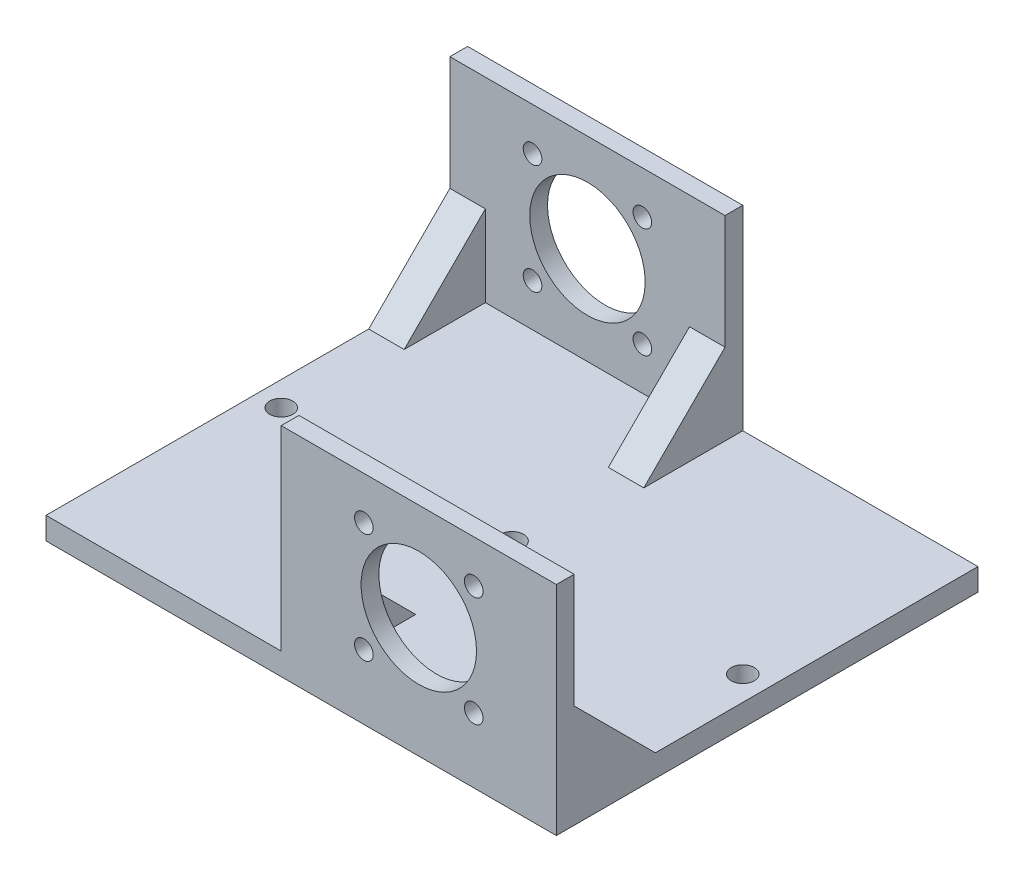
ISO-10303-21;
HEADER;
FILE_DESCRIPTION(('STEP AP214'),'2;1');
FILE_NAME('part.step','',(''),(''),'','','');
FILE_SCHEMA(('AUTOMOTIVE_DESIGN { 1 0 10303 214 1 1 1 1 }'));
ENDSEC;
DATA;
#1=APPLICATION_CONTEXT('core data for automotive mechanical design processes');
#2=APPLICATION_PROTOCOL_DEFINITION('international standard','automotive_design',2000,#1);
#3=PRODUCT_CONTEXT('',#1,'mechanical');
#4=PRODUCT('Part','Part','',(#3));
#5=PRODUCT_RELATED_PRODUCT_CATEGORY('part','',(#4));
#6=PRODUCT_DEFINITION_FORMATION('','',#4);
#7=PRODUCT_DEFINITION_CONTEXT('part definition',#1,'design');
#8=PRODUCT_DEFINITION('design','',#6,#7);
#9=PRODUCT_DEFINITION_SHAPE('','',#8);
#10=(LENGTH_UNIT() NAMED_UNIT(*) SI_UNIT(.MILLI.,.METRE.));
#11=(NAMED_UNIT(*) PLANE_ANGLE_UNIT() SI_UNIT($,.RADIAN.));
#12=(NAMED_UNIT(*) SI_UNIT($,.STERADIAN.) SOLID_ANGLE_UNIT());
#13=UNCERTAINTY_MEASURE_WITH_UNIT(LENGTH_MEASURE(1.E-05),#10,'distance_accuracy_value','');
#14=(GEOMETRIC_REPRESENTATION_CONTEXT(3) GLOBAL_UNCERTAINTY_ASSIGNED_CONTEXT((#13)) GLOBAL_UNIT_ASSIGNED_CONTEXT((#10,
#11,#12)) REPRESENTATION_CONTEXT('',''));
#15=CARTESIAN_POINT('',(0.,0.,0.));
#16=DIRECTION('',(0.,0.,1.));
#17=DIRECTION('',(1.,0.,0.));
#18=AXIS2_PLACEMENT_3D('',#15,#16,#17);
#19=CARTESIAN_POINT('',(0.,5.,0.));
#20=DIRECTION('',(0.,1.,0.));
#21=DIRECTION('',(0.,0.,1.));
#22=AXIS2_PLACEMENT_3D('',#19,#20,#21);
#23=PLANE('',#22);
#24=CARTESIAN_POINT('',(-52.,5.,0.));
#25=DIRECTION('',(0.,1.,0.));
#26=DIRECTION('',(0.,0.,-1.));
#27=AXIS2_PLACEMENT_3D('',#24,#25,#26);
#28=CIRCLE('',#27,2.6);
#29=CARTESIAN_POINT('',(-52.,5.,-2.6));
#30=VERTEX_POINT('',#29);
#31=EDGE_CURVE('E478',#30,#30,#28,.T.);
#32=ORIENTED_EDGE('',*,*,#31,.F.);
#33=EDGE_LOOP('',(#32));
#34=FACE_BOUND('',#33,.T.);
#35=CARTESIAN_POINT('',(52.,5.,0.));
#36=DIRECTION('',(0.,1.,0.));
#37=DIRECTION('',(0.,0.,1.));
#38=AXIS2_PLACEMENT_3D('',#35,#36,#37);
#39=CIRCLE('',#38,2.6);
#40=CARTESIAN_POINT('',(52.,5.,2.6));
#41=VERTEX_POINT('',#40);
#42=EDGE_CURVE('E473',#41,#41,#39,.T.);
#43=ORIENTED_EDGE('',*,*,#42,.F.);
#44=EDGE_LOOP('',(#43));
#45=FACE_BOUND('',#44,.T.);
#46=CARTESIAN_POINT('',(0.,5.,0.));
#47=DIRECTION('',(0.,1.,0.));
#48=DIRECTION('',(0.,0.,1.));
#49=AXIS2_PLACEMENT_3D('',#46,#47,#48);
#50=CIRCLE('',#49,2.6);
#51=CARTESIAN_POINT('',(0.,5.,2.6));
#52=VERTEX_POINT('',#51);
#53=EDGE_CURVE('E476',#52,#52,#50,.T.);
#54=ORIENTED_EDGE('',*,*,#53,.F.);
#55=EDGE_LOOP('',(#54));
#56=FACE_BOUND('',#55,.T.);
#57=DIRECTION('',(0.,0.,-1.));
#58=VECTOR('',#57,1.);
#59=CARTESIAN_POINT('',(-3.50000000000002,5.,-25.2000765028922));
#60=LINE('',#59,#58);
#61=CARTESIAN_POINT('',(-3.50000000000002,5.,-25.2000765028922));
#62=VERTEX_POINT('',#61);
#63=CARTESIAN_POINT('',(-3.50000000000003,5.,-43.5));
#64=VERTEX_POINT('',#63);
#65=EDGE_CURVE('E170',#62,#64,#60,.T.);
#66=ORIENTED_EDGE('',*,*,#65,.T.);
#67=DIRECTION('',(1.,0.,0.));
#68=VECTOR('',#67,1.);
#69=CARTESIAN_POINT('',(-57.5,5.,-43.5));
#70=LINE('',#69,#68);
#71=CARTESIAN_POINT('',(-49.5,5.,-43.5));
#72=VERTEX_POINT('',#71);
#73=EDGE_CURVE('E180',#72,#64,#70,.T.);
#74=ORIENTED_EDGE('',*,*,#73,.F.);
#75=DIRECTION('',(0.,0.,1.));
#76=VECTOR('',#75,1.);
#77=CARTESIAN_POINT('',(-49.5,5.,0.));
#78=LINE('',#77,#76);
#79=CARTESIAN_POINT('',(-49.5,5.,-25.2000765028922));
#80=VERTEX_POINT('',#79);
#81=EDGE_CURVE('E50',#72,#80,#78,.T.);
#82=ORIENTED_EDGE('',*,*,#81,.T.);
#83=DIRECTION('',(-1.,0.,0.));
#84=VECTOR('',#83,1.);
#85=CARTESIAN_POINT('',(0.,5.,-25.2000765028922));
#86=LINE('',#85,#84);
#87=CARTESIAN_POINT('',(-57.5,5.,-25.2000765028922));
#88=VERTEX_POINT('',#87);
#89=EDGE_CURVE('E54',#88,#80,#86,.F.);
#90=ORIENTED_EDGE('',*,*,#89,.F.);
#91=DIRECTION('',(0.,0.,1.));
#92=VECTOR('',#91,1.);
#93=CARTESIAN_POINT('',(-57.5,5.,-47.5));
#94=LINE('',#93,#92);
#95=CARTESIAN_POINT('',(-57.5,5.,47.5));
#96=VERTEX_POINT('',#95);
#97=EDGE_CURVE('E273',#88,#96,#94,.T.);
#98=ORIENTED_EDGE('',*,*,#97,.T.);
#99=DIRECTION('',(1.,0.,0.));
#100=VECTOR('',#99,1.);
#101=CARTESIAN_POINT('',(-57.5,5.,47.5));
#102=LINE('',#101,#100);
#103=CARTESIAN_POINT('',(-4.50000000000001,5.,47.5));
#104=VERTEX_POINT('',#103);
#105=EDGE_CURVE('E275',#96,#104,#102,.T.);
#106=ORIENTED_EDGE('',*,*,#105,.T.);
#107=DIRECTION('',(0.,0.,1.));
#108=VECTOR('',#107,1.);
#109=CARTESIAN_POINT('',(-4.50000000000001,5.,47.5));
#110=LINE('',#109,#108);
#111=CARTESIAN_POINT('',(-4.50000000000001,5.,25.1931640512547));
#112=VERTEX_POINT('',#111);
#113=EDGE_CURVE('E228',#112,#104,#110,.T.);
#114=ORIENTED_EDGE('',*,*,#113,.F.);
#115=DIRECTION('',(1.,0.,0.));
#116=VECTOR('',#115,1.);
#117=CARTESIAN_POINT('',(0.,5.,25.1931640512547));
#118=LINE('',#117,#116);
#119=CARTESIAN_POINT('',(3.49999999999999,5.,25.1931640512547));
#120=VERTEX_POINT('',#119);
#121=EDGE_CURVE('E206',#120,#112,#118,.F.);
#122=ORIENTED_EDGE('',*,*,#121,.F.);
#123=DIRECTION('',(0.,0.,1.));
#124=VECTOR('',#123,1.);
#125=CARTESIAN_POINT('',(3.5,5.,0.));
#126=LINE('',#125,#124);
#127=CARTESIAN_POINT('',(3.49999999999999,5.,43.5));
#128=VERTEX_POINT('',#127);
#129=EDGE_CURVE('E209',#120,#128,#126,.T.);
#130=ORIENTED_EDGE('',*,*,#129,.T.);
#131=DIRECTION('',(-1.,0.,0.));
#132=VECTOR('',#131,1.);
#133=CARTESIAN_POINT('',(57.5,5.,43.5));
#134=LINE('',#133,#132);
#135=CARTESIAN_POINT('',(49.5,5.,43.5));
#136=VERTEX_POINT('',#135);
#137=EDGE_CURVE('E223',#136,#128,#134,.T.);
#138=ORIENTED_EDGE('',*,*,#137,.F.);
#139=DIRECTION('',(0.,0.,-1.));
#140=VECTOR('',#139,1.);
#141=CARTESIAN_POINT('',(49.5,5.,0.));
#142=LINE('',#141,#140);
#143=CARTESIAN_POINT('',(49.5,5.,25.1931640512547));
#144=VERTEX_POINT('',#143);
#145=EDGE_CURVE('E216',#136,#144,#142,.T.);
#146=ORIENTED_EDGE('',*,*,#145,.T.);
#147=DIRECTION('',(1.,0.,0.));
#148=VECTOR('',#147,1.);
#149=CARTESIAN_POINT('',(0.,5.,25.1931640512548));
#150=LINE('',#149,#148);
#151=CARTESIAN_POINT('',(57.5,5.,25.1931640512547));
#152=VERTEX_POINT('',#151);
#153=EDGE_CURVE('E220',#152,#144,#150,.F.);
#154=ORIENTED_EDGE('',*,*,#153,.F.);
#155=DIRECTION('',(0.,0.,-1.));
#156=VECTOR('',#155,1.);
#157=CARTESIAN_POINT('',(57.5,5.,-47.5));
#158=LINE('',#157,#156);
#159=CARTESIAN_POINT('',(57.5,5.,-47.5));
#160=VERTEX_POINT('',#159);
#161=EDGE_CURVE('E268',#152,#160,#158,.T.);
#162=ORIENTED_EDGE('',*,*,#161,.T.);
#163=DIRECTION('',(-1.,0.,0.));
#164=VECTOR('',#163,1.);
#165=CARTESIAN_POINT('',(-57.5,5.,-47.5));
#166=LINE('',#165,#164);
#167=CARTESIAN_POINT('',(4.49999999999997,5.,-47.5));
#168=VERTEX_POINT('',#167);
#169=EDGE_CURVE('E270',#160,#168,#166,.T.);
#170=ORIENTED_EDGE('',*,*,#169,.T.);
#171=DIRECTION('',(0.,0.,-1.));
#172=VECTOR('',#171,1.);
#173=CARTESIAN_POINT('',(4.49999999999997,5.,-47.5));
#174=LINE('',#173,#172);
#175=CARTESIAN_POINT('',(4.49999999999998,5.,-25.2000765028922));
#176=VERTEX_POINT('',#175);
#177=EDGE_CURVE('E250',#176,#168,#174,.T.);
#178=ORIENTED_EDGE('',*,*,#177,.F.);
#179=DIRECTION('',(1.,0.,0.));
#180=VECTOR('',#179,1.);
#181=CARTESIAN_POINT('',(-3.50000000000002,5.,-25.2000765028922));
#182=LINE('',#181,#180);
#183=EDGE_CURVE('E169',#62,#176,#182,.T.);
#184=ORIENTED_EDGE('',*,*,#183,.F.);
#185=EDGE_LOOP('',(#66,#74,#82,#90,#98,#106,#114,#122,#130,#138,#146,#154,#162,#170,#178,#184));
#186=FACE_BOUND('',#185,.T.);
#187=ADVANCED_FACE('F35',(#34,#45,#56,#186),#23,.T.);
#188=CARTESIAN_POINT('',(57.5,5.,-47.5));
#189=DIRECTION('',(-1.,0.,0.));
#190=DIRECTION('',(0.,0.,1.));
#191=AXIS2_PLACEMENT_3D('',#188,#189,#190);
#192=PLANE('',#191);
#193=ORIENTED_EDGE('',*,*,#161,.F.);
#194=DIRECTION('',(0.,-0.707106781186549,-0.707106781186546));
#195=VECTOR('',#194,1.);
#196=CARTESIAN_POINT('',(57.5,23.3068359487453,43.5));
#197=LINE('',#196,#195);
#198=CARTESIAN_POINT('',(57.5,23.3068359487453,43.5));
#199=VERTEX_POINT('',#198);
#200=EDGE_CURVE('E213',#199,#152,#197,.T.);
#201=ORIENTED_EDGE('',*,*,#200,.F.);
#202=DIRECTION('',(0.,-1.,0.));
#203=VECTOR('',#202,1.);
#204=CARTESIAN_POINT('',(57.5,49.,43.5));
#205=LINE('',#204,#203);
#206=CARTESIAN_POINT('',(57.5,49.,43.5));
#207=VERTEX_POINT('',#206);
#208=EDGE_CURVE('E244',#207,#199,#205,.T.);
#209=ORIENTED_EDGE('',*,*,#208,.F.);
#210=DIRECTION('',(0.,0.,-1.));
#211=VECTOR('',#210,1.);
#212=CARTESIAN_POINT('',(57.5,49.,47.5));
#213=LINE('',#212,#211);
#214=CARTESIAN_POINT('',(57.5,49.,47.5));
#215=VERTEX_POINT('',#214);
#216=EDGE_CURVE('E224',#215,#207,#213,.T.);
#217=ORIENTED_EDGE('',*,*,#216,.F.);
#218=DIRECTION('',(0.,-1.,0.));
#219=VECTOR('',#218,1.);
#220=CARTESIAN_POINT('',(57.5,5.,47.5));
#221=LINE('',#220,#219);
#222=CARTESIAN_POINT('',(57.5,0.,47.5));
#223=VERTEX_POINT('',#222);
#224=EDGE_CURVE('E278',#215,#223,#221,.T.);
#225=ORIENTED_EDGE('',*,*,#224,.T.);
#226=DIRECTION('',(0.,0.,-1.));
#227=VECTOR('',#226,1.);
#228=CARTESIAN_POINT('',(57.5,0.,-47.5));
#229=LINE('',#228,#227);
#230=CARTESIAN_POINT('',(57.5,0.,-47.5));
#231=VERTEX_POINT('',#230);
#232=EDGE_CURVE('E267',#223,#231,#229,.T.);
#233=ORIENTED_EDGE('',*,*,#232,.T.);
#234=DIRECTION('',(0.,-1.,0.));
#235=VECTOR('',#234,1.);
#236=CARTESIAN_POINT('',(57.5,5.,-47.5));
#237=LINE('',#236,#235);
#238=EDGE_CURVE('E293',#160,#231,#237,.T.);
#239=ORIENTED_EDGE('',*,*,#238,.F.);
#240=EDGE_LOOP('',(#193,#201,#209,#217,#225,#233,#239));
#241=FACE_BOUND('',#240,.T.);
#242=ADVANCED_FACE('F37',(#241),#192,.F.);
#243=CARTESIAN_POINT('',(-57.5,5.,-47.5));
#244=DIRECTION('',(0.,0.,1.));
#245=DIRECTION('',(1.,0.,0.));
#246=AXIS2_PLACEMENT_3D('',#243,#244,#245);
#247=PLANE('',#246);
#248=CARTESIAN_POINT('',(-14.1256313292354,39.3743686707646,-47.5));
#249=DIRECTION('',(0.,0.,-1.));
#250=DIRECTION('',(-1.,0.,0.));
#251=AXIS2_PLACEMENT_3D('',#248,#249,#250);
#252=CIRCLE('',#251,2.09999999999948);
#253=CARTESIAN_POINT('',(-16.2256313292349,39.3743686707646,-47.5));
#254=VERTEX_POINT('',#253);
#255=EDGE_CURVE('E516',#254,#254,#252,.T.);
#256=ORIENTED_EDGE('',*,*,#255,.F.);
#257=EDGE_LOOP('',(#256));
#258=FACE_BOUND('',#257,.T.);
#259=CARTESIAN_POINT('',(-14.1256313292354,14.6256313292354,-47.5));
#260=DIRECTION('',(0.,0.,-1.));
#261=DIRECTION('',(-1.,0.,0.));
#262=AXIS2_PLACEMENT_3D('',#259,#260,#261);
#263=CIRCLE('',#262,2.0999999999974);
#264=CARTESIAN_POINT('',(-16.2256313292328,14.6256313292354,-47.5));
#265=VERTEX_POINT('',#264);
#266=EDGE_CURVE('E534',#265,#265,#263,.T.);
#267=ORIENTED_EDGE('',*,*,#266,.F.);
#268=EDGE_LOOP('',(#267));
#269=FACE_BOUND('',#268,.T.);
#270=CARTESIAN_POINT('',(-38.8743686707646,14.6256313292354,-47.5));
#271=DIRECTION('',(0.,0.,-1.));
#272=DIRECTION('',(-1.,0.,0.));
#273=AXIS2_PLACEMENT_3D('',#270,#271,#272);
#274=CIRCLE('',#273,2.09999999999797);
#275=CARTESIAN_POINT('',(-40.9743686707626,14.6256313292354,-47.5));
#276=VERTEX_POINT('',#275);
#277=EDGE_CURVE('E528',#276,#276,#274,.T.);
#278=ORIENTED_EDGE('',*,*,#277,.F.);
#279=EDGE_LOOP('',(#278));
#280=FACE_BOUND('',#279,.T.);
#281=CARTESIAN_POINT('',(-38.8743686707646,39.3743686707646,-47.5));
#282=DIRECTION('',(0.,0.,-1.));
#283=DIRECTION('',(-1.,0.,0.));
#284=AXIS2_PLACEMENT_3D('',#281,#282,#283);
#285=CIRCLE('',#284,2.09999999999992);
#286=CARTESIAN_POINT('',(-40.9743686707645,39.3743686707646,-47.5));
#287=VERTEX_POINT('',#286);
#288=EDGE_CURVE('E522',#287,#287,#285,.T.);
#289=ORIENTED_EDGE('',*,*,#288,.F.);
#290=EDGE_LOOP('',(#289));
#291=FACE_BOUND('',#290,.T.);
#292=CARTESIAN_POINT('',(-26.5,27.,-47.5));
#293=DIRECTION('',(0.,0.,-1.));
#294=DIRECTION('',(-1.,0.,0.));
#295=AXIS2_PLACEMENT_3D('',#292,#293,#294);
#296=CIRCLE('',#295,13.);
#297=CARTESIAN_POINT('',(-39.5,27.,-47.5));
#298=VERTEX_POINT('',#297);
#299=EDGE_CURVE('E185',#298,#298,#296,.T.);
#300=ORIENTED_EDGE('',*,*,#299,.F.);
#301=EDGE_LOOP('',(#300));
#302=FACE_BOUND('',#301,.T.);
#303=DIRECTION('',(-1.,0.,0.));
#304=VECTOR('',#303,1.);
#305=CARTESIAN_POINT('',(-57.5,0.,-47.5));
#306=LINE('',#305,#304);
#307=CARTESIAN_POINT('',(-57.5,0.,-47.5));
#308=VERTEX_POINT('',#307);
#309=EDGE_CURVE('E280',#231,#308,#306,.T.);
#310=ORIENTED_EDGE('',*,*,#309,.T.);
#311=DIRECTION('',(0.,-1.,0.));
#312=VECTOR('',#311,1.);
#313=CARTESIAN_POINT('',(-57.5,5.,-47.5));
#314=LINE('',#313,#312);
#315=CARTESIAN_POINT('',(-57.5,49.,-47.5));
#316=VERTEX_POINT('',#315);
#317=EDGE_CURVE('E291',#316,#308,#314,.T.);
#318=ORIENTED_EDGE('',*,*,#317,.F.);
#319=DIRECTION('',(-1.,0.,0.));
#320=VECTOR('',#319,1.);
#321=CARTESIAN_POINT('',(-57.5,49.,-47.5));
#322=LINE('',#321,#320);
#323=CARTESIAN_POINT('',(4.49999999999997,49.,-47.5));
#324=VERTEX_POINT('',#323);
#325=EDGE_CURVE('E254',#324,#316,#322,.T.);
#326=ORIENTED_EDGE('',*,*,#325,.F.);
#327=DIRECTION('',(0.,-1.,0.));
#328=VECTOR('',#327,1.);
#329=CARTESIAN_POINT('',(4.49999999999997,49.,-47.5));
#330=LINE('',#329,#328);
#331=EDGE_CURVE('E257',#324,#168,#330,.T.);
#332=ORIENTED_EDGE('',*,*,#331,.T.);
#333=ORIENTED_EDGE('',*,*,#169,.F.);
#334=ORIENTED_EDGE('',*,*,#238,.T.);
#335=EDGE_LOOP('',(#310,#318,#326,#332,#333,#334));
#336=FACE_BOUND('',#335,.T.);
#337=ADVANCED_FACE('F350',(#258,#269,#280,#291,#302,#336),#247,.F.);
#338=CARTESIAN_POINT('',(-57.5,5.,-47.5));
#339=DIRECTION('',(1.,0.,0.));
#340=DIRECTION('',(0.,0.,-1.));
#341=AXIS2_PLACEMENT_3D('',#338,#339,#340);
#342=PLANE('',#341);
#343=ORIENTED_EDGE('',*,*,#97,.F.);
#344=DIRECTION('',(0.,-0.707106781186549,0.707106781186546));
#345=VECTOR('',#344,1.);
#346=CARTESIAN_POINT('',(-57.5,23.2999234971079,-43.5));
#347=LINE('',#346,#345);
#348=CARTESIAN_POINT('',(-57.5,23.2999234971079,-43.5));
#349=VERTEX_POINT('',#348);
#350=EDGE_CURVE('E191',#349,#88,#347,.T.);
#351=ORIENTED_EDGE('',*,*,#350,.F.);
#352=DIRECTION('',(0.,-1.,0.));
#353=VECTOR('',#352,1.);
#354=CARTESIAN_POINT('',(-57.5,49.,-43.5));
#355=LINE('',#354,#353);
#356=CARTESIAN_POINT('',(-57.5,49.,-43.5));
#357=VERTEX_POINT('',#356);
#358=EDGE_CURVE('E265',#357,#349,#355,.T.);
#359=ORIENTED_EDGE('',*,*,#358,.F.);
#360=DIRECTION('',(0.,0.,1.));
#361=VECTOR('',#360,1.);
#362=CARTESIAN_POINT('',(-57.5,49.,-47.5));
#363=LINE('',#362,#361);
#364=EDGE_CURVE('E246',#316,#357,#363,.T.);
#365=ORIENTED_EDGE('',*,*,#364,.F.);
#366=ORIENTED_EDGE('',*,*,#317,.T.);
#367=DIRECTION('',(0.,0.,1.));
#368=VECTOR('',#367,1.);
#369=CARTESIAN_POINT('',(-57.5,0.,-47.5));
#370=LINE('',#369,#368);
#371=CARTESIAN_POINT('',(-57.5,0.,47.5));
#372=VERTEX_POINT('',#371);
#373=EDGE_CURVE('E283',#308,#372,#370,.T.);
#374=ORIENTED_EDGE('',*,*,#373,.T.);
#375=DIRECTION('',(0.,-1.,0.));
#376=VECTOR('',#375,1.);
#377=CARTESIAN_POINT('',(-57.5,5.,47.5));
#378=LINE('',#377,#376);
#379=EDGE_CURVE('E288',#96,#372,#378,.T.);
#380=ORIENTED_EDGE('',*,*,#379,.F.);
#381=EDGE_LOOP('',(#343,#351,#359,#365,#366,#374,#380));
#382=FACE_BOUND('',#381,.T.);
#383=ADVANCED_FACE('F312',(#382),#342,.F.);
#384=CARTESIAN_POINT('',(-57.5,5.,47.5));
#385=DIRECTION('',(0.,0.,-1.));
#386=DIRECTION('',(-1.,0.,0.));
#387=AXIS2_PLACEMENT_3D('',#384,#385,#386);
#388=PLANE('',#387);
#389=CARTESIAN_POINT('',(14.1256313292354,39.3743686707646,47.5));
#390=DIRECTION('',(0.,0.,1.));
#391=DIRECTION('',(1.,0.,0.));
#392=AXIS2_PLACEMENT_3D('',#389,#390,#391);
#393=CIRCLE('',#392,2.09999999999947);
#394=CARTESIAN_POINT('',(16.2256313292349,39.3743686707646,47.5));
#395=VERTEX_POINT('',#394);
#396=EDGE_CURVE('E486',#395,#395,#393,.T.);
#397=ORIENTED_EDGE('',*,*,#396,.F.);
#398=EDGE_LOOP('',(#397));
#399=FACE_BOUND('',#398,.T.);
#400=CARTESIAN_POINT('',(14.1256313292354,14.6256313292354,47.5));
#401=DIRECTION('',(0.,0.,1.));
#402=DIRECTION('',(1.,0.,0.));
#403=AXIS2_PLACEMENT_3D('',#400,#401,#402);
#404=CIRCLE('',#403,2.0999999999974);
#405=CARTESIAN_POINT('',(16.2256313292328,14.6256313292354,47.5));
#406=VERTEX_POINT('',#405);
#407=EDGE_CURVE('E505',#406,#406,#404,.T.);
#408=ORIENTED_EDGE('',*,*,#407,.F.);
#409=EDGE_LOOP('',(#408));
#410=FACE_BOUND('',#409,.T.);
#411=CARTESIAN_POINT('',(38.8743686707646,14.6256313292354,47.5));
#412=DIRECTION('',(0.,0.,1.));
#413=DIRECTION('',(1.,0.,0.));
#414=AXIS2_PLACEMENT_3D('',#411,#412,#413);
#415=CIRCLE('',#414,2.09999999999797);
#416=CARTESIAN_POINT('',(40.9743686707626,14.6256313292354,47.5));
#417=VERTEX_POINT('',#416);
#418=EDGE_CURVE('E499',#417,#417,#415,.T.);
#419=ORIENTED_EDGE('',*,*,#418,.F.);
#420=EDGE_LOOP('',(#419));
#421=FACE_BOUND('',#420,.T.);
#422=CARTESIAN_POINT('',(38.8743686707646,39.3743686707646,47.5));
#423=DIRECTION('',(0.,0.,1.));
#424=DIRECTION('',(1.,0.,0.));
#425=AXIS2_PLACEMENT_3D('',#422,#423,#424);
#426=CIRCLE('',#425,2.09999999999992);
#427=CARTESIAN_POINT('',(40.9743686707645,39.3743686707646,47.5));
#428=VERTEX_POINT('',#427);
#429=EDGE_CURVE('E493',#428,#428,#426,.T.);
#430=ORIENTED_EDGE('',*,*,#429,.F.);
#431=EDGE_LOOP('',(#430));
#432=FACE_BOUND('',#431,.T.);
#433=CARTESIAN_POINT('',(26.5,27.,47.5));
#434=DIRECTION('',(0.,0.,1.));
#435=DIRECTION('',(1.,0.,0.));
#436=AXIS2_PLACEMENT_3D('',#433,#434,#435);
#437=CIRCLE('',#436,13.);
#438=CARTESIAN_POINT('',(39.5,27.,47.5));
#439=VERTEX_POINT('',#438);
#440=EDGE_CURVE('E492',#439,#439,#437,.T.);
#441=ORIENTED_EDGE('',*,*,#440,.F.);
#442=EDGE_LOOP('',(#441));
#443=FACE_BOUND('',#442,.T.);
#444=DIRECTION('',(0.,-1.,0.));
#445=VECTOR('',#444,1.);
#446=CARTESIAN_POINT('',(-4.50000000000001,49.,47.5));
#447=LINE('',#446,#445);
#448=CARTESIAN_POINT('',(-4.50000000000001,49.,47.5));
#449=VERTEX_POINT('',#448);
#450=EDGE_CURVE('E235',#449,#104,#447,.T.);
#451=ORIENTED_EDGE('',*,*,#450,.T.);
#452=ORIENTED_EDGE('',*,*,#105,.F.);
#453=ORIENTED_EDGE('',*,*,#379,.T.);
#454=DIRECTION('',(1.,0.,0.));
#455=VECTOR('',#454,1.);
#456=CARTESIAN_POINT('',(-57.5,0.,47.5));
#457=LINE('',#456,#455);
#458=EDGE_CURVE('E271',#372,#223,#457,.T.);
#459=ORIENTED_EDGE('',*,*,#458,.T.);
#460=ORIENTED_EDGE('',*,*,#224,.F.);
#461=DIRECTION('',(1.,0.,0.));
#462=VECTOR('',#461,1.);
#463=CARTESIAN_POINT('',(57.5,49.,47.5));
#464=LINE('',#463,#462);
#465=EDGE_CURVE('E232',#449,#215,#464,.T.);
#466=ORIENTED_EDGE('',*,*,#465,.F.);
#467=EDGE_LOOP('',(#451,#452,#453,#459,#460,#466));
#468=FACE_BOUND('',#467,.T.);
#469=ADVANCED_FACE('F361',(#399,#410,#421,#432,#443,#468),#388,.F.);
#470=CARTESIAN_POINT('',(0.,0.,0.));
#471=DIRECTION('',(0.,1.,0.));
#472=DIRECTION('',(0.,0.,1.));
#473=AXIS2_PLACEMENT_3D('',#470,#471,#472);
#474=PLANE('',#473);
#475=CARTESIAN_POINT('',(-52.,0.,0.));
#476=DIRECTION('',(0.,1.,0.));
#477=DIRECTION('',(0.,0.,-1.));
#478=AXIS2_PLACEMENT_3D('',#475,#476,#477);
#479=CIRCLE('',#478,2.6);
#480=CARTESIAN_POINT('',(-52.,0.,-2.6));
#481=VERTEX_POINT('',#480);
#482=EDGE_CURVE('E474',#481,#481,#479,.T.);
#483=ORIENTED_EDGE('',*,*,#482,.T.);
#484=EDGE_LOOP('',(#483));
#485=FACE_BOUND('',#484,.T.);
#486=CARTESIAN_POINT('',(52.,0.,0.));
#487=DIRECTION('',(0.,1.,0.));
#488=DIRECTION('',(0.,0.,1.));
#489=AXIS2_PLACEMENT_3D('',#486,#487,#488);
#490=CIRCLE('',#489,2.6);
#491=CARTESIAN_POINT('',(52.,0.,2.6));
#492=VERTEX_POINT('',#491);
#493=EDGE_CURVE('E470',#492,#492,#490,.T.);
#494=ORIENTED_EDGE('',*,*,#493,.T.);
#495=EDGE_LOOP('',(#494));
#496=FACE_BOUND('',#495,.T.);
#497=CARTESIAN_POINT('',(0.,0.,0.));
#498=DIRECTION('',(0.,1.,0.));
#499=DIRECTION('',(0.,0.,1.));
#500=AXIS2_PLACEMENT_3D('',#497,#498,#499);
#501=CIRCLE('',#500,2.6);
#502=CARTESIAN_POINT('',(0.,0.,2.6));
#503=VERTEX_POINT('',#502);
#504=EDGE_CURVE('E483',#503,#503,#501,.T.);
#505=ORIENTED_EDGE('',*,*,#504,.T.);
#506=EDGE_LOOP('',(#505));
#507=FACE_BOUND('',#506,.T.);
#508=ORIENTED_EDGE('',*,*,#458,.F.);
#509=ORIENTED_EDGE('',*,*,#373,.F.);
#510=ORIENTED_EDGE('',*,*,#309,.F.);
#511=ORIENTED_EDGE('',*,*,#232,.F.);
#512=EDGE_LOOP('',(#508,#509,#510,#511));
#513=FACE_BOUND('',#512,.T.);
#514=ADVANCED_FACE('F362',(#485,#496,#507,#513),#474,.F.);
#515=CARTESIAN_POINT('',(-57.5,49.,-43.5));
#516=DIRECTION('',(0.,0.,-1.));
#517=DIRECTION('',(-1.,0.,0.));
#518=AXIS2_PLACEMENT_3D('',#515,#516,#517);
#519=PLANE('',#518);
#520=CARTESIAN_POINT('',(-14.1256313292354,39.3743686707646,-43.5));
#521=DIRECTION('',(0.,0.,-1.));
#522=DIRECTION('',(-1.,0.,0.));
#523=AXIS2_PLACEMENT_3D('',#520,#521,#522);
#524=CIRCLE('',#523,2.09999999999948);
#525=CARTESIAN_POINT('',(-16.2256313292349,39.3743686707646,-43.5));
#526=VERTEX_POINT('',#525);
#527=EDGE_CURVE('E537',#526,#526,#524,.T.);
#528=ORIENTED_EDGE('',*,*,#527,.T.);
#529=EDGE_LOOP('',(#528));
#530=FACE_BOUND('',#529,.T.);
#531=CARTESIAN_POINT('',(-14.1256313292354,14.6256313292354,-43.5));
#532=DIRECTION('',(0.,0.,-1.));
#533=DIRECTION('',(-1.,0.,0.));
#534=AXIS2_PLACEMENT_3D('',#531,#532,#533);
#535=CIRCLE('',#534,2.0999999999974);
#536=CARTESIAN_POINT('',(-16.2256313292328,14.6256313292354,-43.5));
#537=VERTEX_POINT('',#536);
#538=EDGE_CURVE('E531',#537,#537,#535,.T.);
#539=ORIENTED_EDGE('',*,*,#538,.T.);
#540=EDGE_LOOP('',(#539));
#541=FACE_BOUND('',#540,.T.);
#542=CARTESIAN_POINT('',(-38.8743686707646,14.6256313292354,-43.5));
#543=DIRECTION('',(0.,0.,-1.));
#544=DIRECTION('',(-1.,0.,0.));
#545=AXIS2_PLACEMENT_3D('',#542,#543,#544);
#546=CIRCLE('',#545,2.09999999999797);
#547=CARTESIAN_POINT('',(-40.9743686707626,14.6256313292354,-43.5));
#548=VERTEX_POINT('',#547);
#549=EDGE_CURVE('E525',#548,#548,#546,.T.);
#550=ORIENTED_EDGE('',*,*,#549,.T.);
#551=EDGE_LOOP('',(#550));
#552=FACE_BOUND('',#551,.T.);
#553=CARTESIAN_POINT('',(-38.8743686707646,39.3743686707646,-43.5));
#554=DIRECTION('',(0.,0.,-1.));
#555=DIRECTION('',(-1.,0.,0.));
#556=AXIS2_PLACEMENT_3D('',#553,#554,#555);
#557=CIRCLE('',#556,2.09999999999992);
#558=CARTESIAN_POINT('',(-40.9743686707645,39.3743686707646,-43.5));
#559=VERTEX_POINT('',#558);
#560=EDGE_CURVE('E519',#559,#559,#557,.T.);
#561=ORIENTED_EDGE('',*,*,#560,.T.);
#562=EDGE_LOOP('',(#561));
#563=FACE_BOUND('',#562,.T.);
#564=CARTESIAN_POINT('',(-26.5,27.,-43.5));
#565=DIRECTION('',(0.,0.,-1.));
#566=DIRECTION('',(-1.,0.,0.));
#567=AXIS2_PLACEMENT_3D('',#564,#565,#566);
#568=CIRCLE('',#567,13.);
#569=CARTESIAN_POINT('',(-39.5,27.,-43.5));
#570=VERTEX_POINT('',#569);
#571=EDGE_CURVE('E182',#570,#570,#568,.T.);
#572=ORIENTED_EDGE('',*,*,#571,.T.);
#573=EDGE_LOOP('',(#572));
#574=FACE_BOUND('',#573,.T.);
#575=DIRECTION('',(0.,1.,0.));
#576=VECTOR('',#575,1.);
#577=CARTESIAN_POINT('',(-3.50000000000003,5.,-43.5));
#578=LINE('',#577,#576);
#579=CARTESIAN_POINT('',(-3.50000000000003,23.2999234971079,-43.5));
#580=VERTEX_POINT('',#579);
#581=EDGE_CURVE('E174',#64,#580,#578,.T.);
#582=ORIENTED_EDGE('',*,*,#581,.T.);
#583=DIRECTION('',(1.,0.,0.));
#584=VECTOR('',#583,1.);
#585=CARTESIAN_POINT('',(-3.50000000000003,23.2999234971079,-43.5));
#586=LINE('',#585,#584);
#587=CARTESIAN_POINT('',(4.49999999999997,23.2999234971079,-43.5));
#588=VERTEX_POINT('',#587);
#589=EDGE_CURVE('E157',#580,#588,#586,.T.);
#590=ORIENTED_EDGE('',*,*,#589,.T.);
#591=DIRECTION('',(0.,-1.,0.));
#592=VECTOR('',#591,1.);
#593=CARTESIAN_POINT('',(4.49999999999997,49.,-43.5));
#594=LINE('',#593,#592);
#595=CARTESIAN_POINT('',(4.49999999999997,49.,-43.5));
#596=VERTEX_POINT('',#595);
#597=EDGE_CURVE('E263',#596,#588,#594,.T.);
#598=ORIENTED_EDGE('',*,*,#597,.F.);
#599=DIRECTION('',(1.,0.,0.));
#600=VECTOR('',#599,1.);
#601=CARTESIAN_POINT('',(-57.5,49.,-43.5));
#602=LINE('',#601,#600);
#603=EDGE_CURVE('E249',#357,#596,#602,.T.);
#604=ORIENTED_EDGE('',*,*,#603,.F.);
#605=ORIENTED_EDGE('',*,*,#358,.T.);
#606=DIRECTION('',(-1.,0.,0.));
#607=VECTOR('',#606,1.);
#608=CARTESIAN_POINT('',(-57.5,23.2999234971079,-43.5));
#609=LINE('',#608,#607);
#610=CARTESIAN_POINT('',(-49.5,23.2999234971079,-43.5));
#611=VERTEX_POINT('',#610);
#612=EDGE_CURVE('E11',#349,#611,#609,.F.);
#613=ORIENTED_EDGE('',*,*,#612,.T.);
#614=DIRECTION('',(0.,1.,0.));
#615=VECTOR('',#614,1.);
#616=CARTESIAN_POINT('',(-49.5,49.,-43.5));
#617=LINE('',#616,#615);
#618=EDGE_CURVE('E43',#72,#611,#617,.T.);
#619=ORIENTED_EDGE('',*,*,#618,.F.);
#620=ORIENTED_EDGE('',*,*,#73,.T.);
#621=EDGE_LOOP('',(#582,#590,#598,#604,#605,#613,#619,#620));
#622=FACE_BOUND('',#621,.T.);
#623=ADVANCED_FACE('F179',(#530,#541,#552,#563,#574,#622),#519,.F.);
#624=CARTESIAN_POINT('',(4.49999999999997,49.,-47.5));
#625=DIRECTION('',(-1.,0.,0.));
#626=DIRECTION('',(0.,0.,1.));
#627=AXIS2_PLACEMENT_3D('',#624,#625,#626);
#628=PLANE('',#627);
#629=ORIENTED_EDGE('',*,*,#177,.T.);
#630=ORIENTED_EDGE('',*,*,#331,.F.);
#631=DIRECTION('',(0.,0.,-1.));
#632=VECTOR('',#631,1.);
#633=CARTESIAN_POINT('',(4.49999999999997,49.,-47.5));
#634=LINE('',#633,#632);
#635=EDGE_CURVE('E252',#596,#324,#634,.T.);
#636=ORIENTED_EDGE('',*,*,#635,.F.);
#637=ORIENTED_EDGE('',*,*,#597,.T.);
#638=DIRECTION('',(0.,-0.707106781186549,0.707106781186546));
#639=VECTOR('',#638,1.);
#640=CARTESIAN_POINT('',(4.49999999999997,23.2999234971079,-43.5));
#641=LINE('',#640,#639);
#642=EDGE_CURVE('E164',#588,#176,#641,.T.);
#643=ORIENTED_EDGE('',*,*,#642,.T.);
#644=EDGE_LOOP('',(#629,#630,#636,#637,#643));
#645=FACE_BOUND('',#644,.T.);
#646=ADVANCED_FACE('F355',(#645),#628,.F.);
#647=CARTESIAN_POINT('',(0.,49.,0.));
#648=DIRECTION('',(0.,1.,0.));
#649=DIRECTION('',(0.,0.,1.));
#650=AXIS2_PLACEMENT_3D('',#647,#648,#649);
#651=PLANE('',#650);
#652=ORIENTED_EDGE('',*,*,#364,.T.);
#653=ORIENTED_EDGE('',*,*,#603,.T.);
#654=ORIENTED_EDGE('',*,*,#635,.T.);
#655=ORIENTED_EDGE('',*,*,#325,.T.);
#656=EDGE_LOOP('',(#652,#653,#654,#655));
#657=FACE_BOUND('',#656,.T.);
#658=ADVANCED_FACE('F358',(#657),#651,.T.);
#659=CARTESIAN_POINT('',(57.5,49.,43.5));
#660=DIRECTION('',(0.,0.,1.));
#661=DIRECTION('',(1.,0.,0.));
#662=AXIS2_PLACEMENT_3D('',#659,#660,#661);
#663=PLANE('',#662);
#664=CARTESIAN_POINT('',(14.1256313292354,39.3743686707646,43.5));
#665=DIRECTION('',(0.,0.,1.));
#666=DIRECTION('',(1.,0.,0.));
#667=AXIS2_PLACEMENT_3D('',#664,#665,#666);
#668=CIRCLE('',#667,2.09999999999947);
#669=CARTESIAN_POINT('',(16.2256313292349,39.3743686707646,43.5));
#670=VERTEX_POINT('',#669);
#671=EDGE_CURVE('E508',#670,#670,#668,.T.);
#672=ORIENTED_EDGE('',*,*,#671,.T.);
#673=EDGE_LOOP('',(#672));
#674=FACE_BOUND('',#673,.T.);
#675=CARTESIAN_POINT('',(14.1256313292354,14.6256313292354,43.5));
#676=DIRECTION('',(0.,0.,1.));
#677=DIRECTION('',(1.,0.,0.));
#678=AXIS2_PLACEMENT_3D('',#675,#676,#677);
#679=CIRCLE('',#678,2.0999999999974);
#680=CARTESIAN_POINT('',(16.2256313292328,14.6256313292354,43.5));
#681=VERTEX_POINT('',#680);
#682=EDGE_CURVE('E502',#681,#681,#679,.T.);
#683=ORIENTED_EDGE('',*,*,#682,.T.);
#684=EDGE_LOOP('',(#683));
#685=FACE_BOUND('',#684,.T.);
#686=CARTESIAN_POINT('',(38.8743686707646,14.6256313292354,43.5));
#687=DIRECTION('',(0.,0.,1.));
#688=DIRECTION('',(1.,0.,0.));
#689=AXIS2_PLACEMENT_3D('',#686,#687,#688);
#690=CIRCLE('',#689,2.09999999999797);
#691=CARTESIAN_POINT('',(40.9743686707626,14.6256313292354,43.5));
#692=VERTEX_POINT('',#691);
#693=EDGE_CURVE('E496',#692,#692,#690,.T.);
#694=ORIENTED_EDGE('',*,*,#693,.T.);
#695=EDGE_LOOP('',(#694));
#696=FACE_BOUND('',#695,.T.);
#697=CARTESIAN_POINT('',(38.8743686707646,39.3743686707646,43.5));
#698=DIRECTION('',(0.,0.,1.));
#699=DIRECTION('',(1.,0.,0.));
#700=AXIS2_PLACEMENT_3D('',#697,#698,#699);
#701=CIRCLE('',#700,2.09999999999992);
#702=CARTESIAN_POINT('',(40.9743686707645,39.3743686707646,43.5));
#703=VERTEX_POINT('',#702);
#704=EDGE_CURVE('E489',#703,#703,#701,.T.);
#705=ORIENTED_EDGE('',*,*,#704,.T.);
#706=EDGE_LOOP('',(#705));
#707=FACE_BOUND('',#706,.T.);
#708=CARTESIAN_POINT('',(26.5,27.,43.5));
#709=DIRECTION('',(0.,0.,1.));
#710=DIRECTION('',(1.,0.,0.));
#711=AXIS2_PLACEMENT_3D('',#708,#709,#710);
#712=CIRCLE('',#711,13.);
#713=CARTESIAN_POINT('',(39.5,27.,43.5));
#714=VERTEX_POINT('',#713);
#715=EDGE_CURVE('E513',#714,#714,#712,.T.);
#716=ORIENTED_EDGE('',*,*,#715,.T.);
#717=EDGE_LOOP('',(#716));
#718=FACE_BOUND('',#717,.T.);
#719=DIRECTION('',(0.,-1.,0.));
#720=VECTOR('',#719,1.);
#721=CARTESIAN_POINT('',(3.49999999999999,49.,43.5));
#722=LINE('',#721,#720);
#723=CARTESIAN_POINT('',(3.49999999999999,23.3068359487453,43.5));
#724=VERTEX_POINT('',#723);
#725=EDGE_CURVE('E301',#724,#128,#722,.T.);
#726=ORIENTED_EDGE('',*,*,#725,.F.);
#727=DIRECTION('',(1.,0.,0.));
#728=VECTOR('',#727,1.);
#729=CARTESIAN_POINT('',(57.5,23.3068359487453,43.5));
#730=LINE('',#729,#728);
#731=CARTESIAN_POINT('',(-4.50000000000001,23.3068359487453,43.5));
#732=VERTEX_POINT('',#731);
#733=EDGE_CURVE('E201',#724,#732,#730,.F.);
#734=ORIENTED_EDGE('',*,*,#733,.T.);
#735=DIRECTION('',(0.,-1.,0.));
#736=VECTOR('',#735,1.);
#737=CARTESIAN_POINT('',(-4.50000000000001,49.,43.5));
#738=LINE('',#737,#736);
#739=CARTESIAN_POINT('',(-4.50000000000001,49.,43.5));
#740=VERTEX_POINT('',#739);
#741=EDGE_CURVE('E241',#740,#732,#738,.T.);
#742=ORIENTED_EDGE('',*,*,#741,.F.);
#743=DIRECTION('',(-1.,0.,0.));
#744=VECTOR('',#743,1.);
#745=CARTESIAN_POINT('',(57.5,49.,43.5));
#746=LINE('',#745,#744);
#747=EDGE_CURVE('E227',#207,#740,#746,.T.);
#748=ORIENTED_EDGE('',*,*,#747,.F.);
#749=ORIENTED_EDGE('',*,*,#208,.T.);
#750=DIRECTION('',(1.,0.,0.));
#751=VECTOR('',#750,1.);
#752=CARTESIAN_POINT('',(57.5,23.3068359487453,43.5));
#753=LINE('',#752,#751);
#754=CARTESIAN_POINT('',(49.5,23.3068359487453,43.5));
#755=VERTEX_POINT('',#754);
#756=EDGE_CURVE('E299',#199,#755,#753,.F.);
#757=ORIENTED_EDGE('',*,*,#756,.T.);
#758=DIRECTION('',(0.,1.,0.));
#759=VECTOR('',#758,1.);
#760=CARTESIAN_POINT('',(49.5,49.,43.5));
#761=LINE('',#760,#759);
#762=EDGE_CURVE('E296',#136,#755,#761,.T.);
#763=ORIENTED_EDGE('',*,*,#762,.F.);
#764=ORIENTED_EDGE('',*,*,#137,.T.);
#765=EDGE_LOOP('',(#726,#734,#742,#748,#749,#757,#763,#764));
#766=FACE_BOUND('',#765,.T.);
#767=ADVANCED_FACE('F330',(#674,#685,#696,#707,#718,#766),#663,.F.);
#768=CARTESIAN_POINT('',(-4.50000000000001,49.,47.5));
#769=DIRECTION('',(1.,0.,0.));
#770=DIRECTION('',(0.,0.,-1.));
#771=AXIS2_PLACEMENT_3D('',#768,#769,#770);
#772=PLANE('',#771);
#773=ORIENTED_EDGE('',*,*,#741,.T.);
#774=DIRECTION('',(0.,0.707106781186549,0.707106781186546));
#775=VECTOR('',#774,1.);
#776=CARTESIAN_POINT('',(-4.50000000000001,5.,25.1931640512547));
#777=LINE('',#776,#775);
#778=EDGE_CURVE('E199',#112,#732,#777,.T.);
#779=ORIENTED_EDGE('',*,*,#778,.F.);
#780=ORIENTED_EDGE('',*,*,#113,.T.);
#781=ORIENTED_EDGE('',*,*,#450,.F.);
#782=DIRECTION('',(0.,0.,1.));
#783=VECTOR('',#782,1.);
#784=CARTESIAN_POINT('',(-4.50000000000001,49.,47.5));
#785=LINE('',#784,#783);
#786=EDGE_CURVE('E230',#740,#449,#785,.T.);
#787=ORIENTED_EDGE('',*,*,#786,.F.);
#788=EDGE_LOOP('',(#773,#779,#780,#781,#787));
#789=FACE_BOUND('',#788,.T.);
#790=ADVANCED_FACE('F321',(#789),#772,.F.);
#791=CARTESIAN_POINT('',(0.,49.,0.));
#792=DIRECTION('',(0.,1.,0.));
#793=DIRECTION('',(0.,0.,1.));
#794=AXIS2_PLACEMENT_3D('',#791,#792,#793);
#795=PLANE('',#794);
#796=ORIENTED_EDGE('',*,*,#216,.T.);
#797=ORIENTED_EDGE('',*,*,#747,.T.);
#798=ORIENTED_EDGE('',*,*,#786,.T.);
#799=ORIENTED_EDGE('',*,*,#465,.T.);
#800=EDGE_LOOP('',(#796,#797,#798,#799));
#801=FACE_BOUND('',#800,.T.);
#802=ADVANCED_FACE('F394',(#801),#795,.T.);
#803=CARTESIAN_POINT('',(57.5,23.3068359487453,43.5));
#804=DIRECTION('',(0.,-0.707106781186546,0.707106781186549));
#805=DIRECTION('',(0.,-0.707106781186549,-0.707106781186546));
#806=AXIS2_PLACEMENT_3D('',#803,#804,#805);
#807=PLANE('',#806);
#808=ORIENTED_EDGE('',*,*,#200,.T.);
#809=ORIENTED_EDGE('',*,*,#153,.T.);
#810=DIRECTION('',(0.,-0.707106781186549,-0.707106781186546));
#811=VECTOR('',#810,1.);
#812=CARTESIAN_POINT('',(49.5,23.3068359487453,43.5));
#813=LINE('',#812,#811);
#814=EDGE_CURVE('E212',#755,#144,#813,.T.);
#815=ORIENTED_EDGE('',*,*,#814,.F.);
#816=ORIENTED_EDGE('',*,*,#756,.F.);
#817=EDGE_LOOP('',(#808,#809,#815,#816));
#818=FACE_BOUND('',#817,.T.);
#819=ADVANCED_FACE('F340',(#818),#807,.F.);
#820=CARTESIAN_POINT('',(49.5,24.5,0.));
#821=DIRECTION('',(1.,0.,0.));
#822=DIRECTION('',(0.,0.,-1.));
#823=AXIS2_PLACEMENT_3D('',#820,#821,#822);
#824=PLANE('',#823);
#825=ORIENTED_EDGE('',*,*,#145,.F.);
#826=ORIENTED_EDGE('',*,*,#762,.T.);
#827=ORIENTED_EDGE('',*,*,#814,.T.);
#828=EDGE_LOOP('',(#825,#826,#827));
#829=FACE_BOUND('',#828,.T.);
#830=ADVANCED_FACE('F336',(#829),#824,.F.);
#831=CARTESIAN_POINT('',(-4.50000000000001,5.,25.1931640512547));
#832=DIRECTION('',(0.,-0.707106781186546,0.707106781186549));
#833=DIRECTION('',(0.,0.707106781186549,0.707106781186546));
#834=AXIS2_PLACEMENT_3D('',#831,#832,#833);
#835=PLANE('',#834);
#836=DIRECTION('',(0.,0.707106781186549,0.707106781186546));
#837=VECTOR('',#836,1.);
#838=CARTESIAN_POINT('',(3.49999999999999,5.,25.1931640512547));
#839=LINE('',#838,#837);
#840=EDGE_CURVE('E198',#120,#724,#839,.T.);
#841=ORIENTED_EDGE('',*,*,#840,.F.);
#842=ORIENTED_EDGE('',*,*,#121,.T.);
#843=ORIENTED_EDGE('',*,*,#778,.T.);
#844=ORIENTED_EDGE('',*,*,#733,.F.);
#845=EDGE_LOOP('',(#841,#842,#843,#844));
#846=FACE_BOUND('',#845,.T.);
#847=ADVANCED_FACE('F327',(#846),#835,.F.);
#848=CARTESIAN_POINT('',(3.5,24.5,0.));
#849=DIRECTION('',(-1.,0.,0.));
#850=DIRECTION('',(0.,0.,1.));
#851=AXIS2_PLACEMENT_3D('',#848,#849,#850);
#852=PLANE('',#851);
#853=ORIENTED_EDGE('',*,*,#129,.F.);
#854=ORIENTED_EDGE('',*,*,#840,.T.);
#855=ORIENTED_EDGE('',*,*,#725,.T.);
#856=EDGE_LOOP('',(#853,#854,#855));
#857=FACE_BOUND('',#856,.T.);
#858=ADVANCED_FACE('F333',(#857),#852,.F.);
#859=CARTESIAN_POINT('',(-57.5,23.2999234971079,-43.5));
#860=DIRECTION('',(0.,-0.707106781186546,-0.707106781186549));
#861=DIRECTION('',(0.,-0.707106781186549,0.707106781186546));
#862=AXIS2_PLACEMENT_3D('',#859,#860,#861);
#863=PLANE('',#862);
#864=ORIENTED_EDGE('',*,*,#350,.T.);
#865=ORIENTED_EDGE('',*,*,#89,.T.);
#866=DIRECTION('',(0.,-0.707106781186549,0.707106781186546));
#867=VECTOR('',#866,1.);
#868=CARTESIAN_POINT('',(-49.5,23.2999234971079,-43.5));
#869=LINE('',#868,#867);
#870=EDGE_CURVE('E189',#611,#80,#869,.T.);
#871=ORIENTED_EDGE('',*,*,#870,.F.);
#872=ORIENTED_EDGE('',*,*,#612,.F.);
#873=EDGE_LOOP('',(#864,#865,#871,#872));
#874=FACE_BOUND('',#873,.T.);
#875=ADVANCED_FACE('F308',(#874),#863,.F.);
#876=CARTESIAN_POINT('',(-49.5,24.5,0.));
#877=DIRECTION('',(-1.,0.,0.));
#878=DIRECTION('',(0.,0.,1.));
#879=AXIS2_PLACEMENT_3D('',#876,#877,#878);
#880=PLANE('',#879);
#881=ORIENTED_EDGE('',*,*,#81,.F.);
#882=ORIENTED_EDGE('',*,*,#618,.T.);
#883=ORIENTED_EDGE('',*,*,#870,.T.);
#884=EDGE_LOOP('',(#881,#882,#883));
#885=FACE_BOUND('',#884,.T.);
#886=ADVANCED_FACE('F305',(#885),#880,.F.);
#887=CARTESIAN_POINT('',(-3.50000000000003,23.2999234971079,-43.5));
#888=DIRECTION('',(0.,0.707106781186546,0.707106781186549));
#889=DIRECTION('',(0.,-0.707106781186549,0.707106781186546));
#890=AXIS2_PLACEMENT_3D('',#887,#888,#889);
#891=PLANE('',#890);
#892=ORIENTED_EDGE('',*,*,#642,.F.);
#893=ORIENTED_EDGE('',*,*,#589,.F.);
#894=DIRECTION('',(0.,-0.707106781186549,0.707106781186546));
#895=VECTOR('',#894,1.);
#896=CARTESIAN_POINT('',(-3.50000000000003,23.2999234971079,-43.5));
#897=LINE('',#896,#895);
#898=EDGE_CURVE('E161',#580,#62,#897,.T.);
#899=ORIENTED_EDGE('',*,*,#898,.T.);
#900=ORIENTED_EDGE('',*,*,#183,.T.);
#901=EDGE_LOOP('',(#892,#893,#899,#900));
#902=FACE_BOUND('',#901,.T.);
#903=ADVANCED_FACE('F159',(#902),#891,.T.);
#904=CARTESIAN_POINT('',(-3.50000000000002,0.,0.));
#905=DIRECTION('',(-1.,0.,0.));
#906=DIRECTION('',(0.,0.,1.));
#907=AXIS2_PLACEMENT_3D('',#904,#905,#906);
#908=PLANE('',#907);
#909=ORIENTED_EDGE('',*,*,#581,.F.);
#910=ORIENTED_EDGE('',*,*,#65,.F.);
#911=ORIENTED_EDGE('',*,*,#898,.F.);
#912=EDGE_LOOP('',(#909,#910,#911));
#913=FACE_BOUND('',#912,.T.);
#914=ADVANCED_FACE('F173',(#913),#908,.T.);
#915=CARTESIAN_POINT('',(-26.5,27.,-43.5));
#916=DIRECTION('',(0.,0.,-1.));
#917=DIRECTION('',(-1.,0.,0.));
#918=AXIS2_PLACEMENT_3D('',#915,#916,#917);
#919=CYLINDRICAL_SURFACE('',#918,13.);
#920=ORIENTED_EDGE('',*,*,#571,.F.);
#921=EDGE_LOOP('',(#920));
#922=FACE_BOUND('',#921,.T.);
#923=ORIENTED_EDGE('',*,*,#299,.T.);
#924=EDGE_LOOP('',(#923));
#925=FACE_BOUND('',#924,.T.);
#926=ADVANCED_FACE('F414',(#922,#925),#919,.F.);
#927=CARTESIAN_POINT('',(-38.8743686707646,39.3743686707646,-43.5));
#928=DIRECTION('',(0.,0.,-1.));
#929=DIRECTION('',(-1.,0.,0.));
#930=AXIS2_PLACEMENT_3D('',#927,#928,#929);
#931=CYLINDRICAL_SURFACE('',#930,2.09999999999992);
#932=ORIENTED_EDGE('',*,*,#560,.F.);
#933=EDGE_LOOP('',(#932));
#934=FACE_BOUND('',#933,.T.);
#935=ORIENTED_EDGE('',*,*,#288,.T.);
#936=EDGE_LOOP('',(#935));
#937=FACE_BOUND('',#936,.T.);
#938=ADVANCED_FACE('F417',(#934,#937),#931,.F.);
#939=CARTESIAN_POINT('',(-38.8743686707646,14.6256313292354,-43.5));
#940=DIRECTION('',(0.,0.,-1.));
#941=DIRECTION('',(-1.,0.,0.));
#942=AXIS2_PLACEMENT_3D('',#939,#940,#941);
#943=CYLINDRICAL_SURFACE('',#942,2.09999999999797);
#944=ORIENTED_EDGE('',*,*,#549,.F.);
#945=EDGE_LOOP('',(#944));
#946=FACE_BOUND('',#945,.T.);
#947=ORIENTED_EDGE('',*,*,#277,.T.);
#948=EDGE_LOOP('',(#947));
#949=FACE_BOUND('',#948,.T.);
#950=ADVANCED_FACE('F427',(#946,#949),#943,.F.);
#951=CARTESIAN_POINT('',(-14.1256313292354,14.6256313292354,-43.5));
#952=DIRECTION('',(0.,0.,-1.));
#953=DIRECTION('',(-1.,0.,0.));
#954=AXIS2_PLACEMENT_3D('',#951,#952,#953);
#955=CYLINDRICAL_SURFACE('',#954,2.0999999999974);
#956=ORIENTED_EDGE('',*,*,#538,.F.);
#957=EDGE_LOOP('',(#956));
#958=FACE_BOUND('',#957,.T.);
#959=ORIENTED_EDGE('',*,*,#266,.T.);
#960=EDGE_LOOP('',(#959));
#961=FACE_BOUND('',#960,.T.);
#962=ADVANCED_FACE('F423',(#958,#961),#955,.F.);
#963=CARTESIAN_POINT('',(-14.1256313292354,39.3743686707646,-43.5));
#964=DIRECTION('',(0.,0.,-1.));
#965=DIRECTION('',(-1.,0.,0.));
#966=AXIS2_PLACEMENT_3D('',#963,#964,#965);
#967=CYLINDRICAL_SURFACE('',#966,2.09999999999948);
#968=ORIENTED_EDGE('',*,*,#527,.F.);
#969=EDGE_LOOP('',(#968));
#970=FACE_BOUND('',#969,.T.);
#971=ORIENTED_EDGE('',*,*,#255,.T.);
#972=EDGE_LOOP('',(#971));
#973=FACE_BOUND('',#972,.T.);
#974=ADVANCED_FACE('F419',(#970,#973),#967,.F.);
#975=CARTESIAN_POINT('',(26.5,27.,43.5));
#976=DIRECTION('',(0.,0.,1.));
#977=DIRECTION('',(1.,0.,0.));
#978=AXIS2_PLACEMENT_3D('',#975,#976,#977);
#979=CYLINDRICAL_SURFACE('',#978,13.);
#980=ORIENTED_EDGE('',*,*,#715,.F.);
#981=EDGE_LOOP('',(#980));
#982=FACE_BOUND('',#981,.T.);
#983=ORIENTED_EDGE('',*,*,#440,.T.);
#984=EDGE_LOOP('',(#983));
#985=FACE_BOUND('',#984,.T.);
#986=ADVANCED_FACE('F422',(#982,#985),#979,.F.);
#987=CARTESIAN_POINT('',(38.8743686707646,39.3743686707646,43.5));
#988=DIRECTION('',(0.,0.,1.));
#989=DIRECTION('',(1.,0.,0.));
#990=AXIS2_PLACEMENT_3D('',#987,#988,#989);
#991=CYLINDRICAL_SURFACE('',#990,2.09999999999992);
#992=ORIENTED_EDGE('',*,*,#704,.F.);
#993=EDGE_LOOP('',(#992));
#994=FACE_BOUND('',#993,.T.);
#995=ORIENTED_EDGE('',*,*,#429,.T.);
#996=EDGE_LOOP('',(#995));
#997=FACE_BOUND('',#996,.T.);
#998=ADVANCED_FACE('F437',(#994,#997),#991,.F.);
#999=CARTESIAN_POINT('',(38.8743686707646,14.6256313292354,43.5));
#1000=DIRECTION('',(0.,0.,1.));
#1001=DIRECTION('',(1.,0.,0.));
#1002=AXIS2_PLACEMENT_3D('',#999,#1000,#1001);
#1003=CYLINDRICAL_SURFACE('',#1002,2.09999999999797);
#1004=ORIENTED_EDGE('',*,*,#693,.F.);
#1005=EDGE_LOOP('',(#1004));
#1006=FACE_BOUND('',#1005,.T.);
#1007=ORIENTED_EDGE('',*,*,#418,.T.);
#1008=EDGE_LOOP('',(#1007));
#1009=FACE_BOUND('',#1008,.T.);
#1010=ADVANCED_FACE('F447',(#1006,#1009),#1003,.F.);
#1011=CARTESIAN_POINT('',(14.1256313292354,14.6256313292354,43.5));
#1012=DIRECTION('',(0.,0.,1.));
#1013=DIRECTION('',(1.,0.,0.));
#1014=AXIS2_PLACEMENT_3D('',#1011,#1012,#1013);
#1015=CYLINDRICAL_SURFACE('',#1014,2.0999999999974);
#1016=ORIENTED_EDGE('',*,*,#682,.F.);
#1017=EDGE_LOOP('',(#1016));
#1018=FACE_BOUND('',#1017,.T.);
#1019=ORIENTED_EDGE('',*,*,#407,.T.);
#1020=EDGE_LOOP('',(#1019));
#1021=FACE_BOUND('',#1020,.T.);
#1022=ADVANCED_FACE('F443',(#1018,#1021),#1015,.F.);
#1023=CARTESIAN_POINT('',(14.1256313292354,39.3743686707646,43.5));
#1024=DIRECTION('',(0.,0.,1.));
#1025=DIRECTION('',(1.,0.,0.));
#1026=AXIS2_PLACEMENT_3D('',#1023,#1024,#1025);
#1027=CYLINDRICAL_SURFACE('',#1026,2.09999999999947);
#1028=ORIENTED_EDGE('',*,*,#671,.F.);
#1029=EDGE_LOOP('',(#1028));
#1030=FACE_BOUND('',#1029,.T.);
#1031=ORIENTED_EDGE('',*,*,#396,.T.);
#1032=EDGE_LOOP('',(#1031));
#1033=FACE_BOUND('',#1032,.T.);
#1034=ADVANCED_FACE('F439',(#1030,#1033),#1027,.F.);
#1035=CARTESIAN_POINT('',(0.,0.,0.));
#1036=DIRECTION('',(0.,1.,0.));
#1037=DIRECTION('',(0.,0.,1.));
#1038=AXIS2_PLACEMENT_3D('',#1035,#1036,#1037);
#1039=CYLINDRICAL_SURFACE('',#1038,2.6);
#1040=ORIENTED_EDGE('',*,*,#504,.F.);
#1041=EDGE_LOOP('',(#1040));
#1042=FACE_BOUND('',#1041,.T.);
#1043=ORIENTED_EDGE('',*,*,#53,.T.);
#1044=EDGE_LOOP('',(#1043));
#1045=FACE_BOUND('',#1044,.T.);
#1046=ADVANCED_FACE('F442',(#1042,#1045),#1039,.F.);
#1047=CARTESIAN_POINT('',(52.,0.,0.));
#1048=DIRECTION('',(0.,1.,0.));
#1049=DIRECTION('',(0.,0.,1.));
#1050=AXIS2_PLACEMENT_3D('',#1047,#1048,#1049);
#1051=CYLINDRICAL_SURFACE('',#1050,2.6);
#1052=ORIENTED_EDGE('',*,*,#493,.F.);
#1053=EDGE_LOOP('',(#1052));
#1054=FACE_BOUND('',#1053,.T.);
#1055=ORIENTED_EDGE('',*,*,#42,.T.);
#1056=EDGE_LOOP('',(#1055));
#1057=FACE_BOUND('',#1056,.T.);
#1058=ADVANCED_FACE('F457',(#1054,#1057),#1051,.F.);
#1059=CARTESIAN_POINT('',(-52.,0.,0.));
#1060=DIRECTION('',(0.,1.,0.));
#1061=DIRECTION('',(0.,0.,1.));
#1062=AXIS2_PLACEMENT_3D('',#1059,#1060,#1061);
#1063=CYLINDRICAL_SURFACE('',#1062,2.6);
#1064=ORIENTED_EDGE('',*,*,#482,.F.);
#1065=EDGE_LOOP('',(#1064));
#1066=FACE_BOUND('',#1065,.T.);
#1067=ORIENTED_EDGE('',*,*,#31,.T.);
#1068=EDGE_LOOP('',(#1067));
#1069=FACE_BOUND('',#1068,.T.);
#1070=ADVANCED_FACE('F459',(#1066,#1069),#1063,.F.);
#1071=CLOSED_SHELL('',(#187,#242,#337,#383,#469,#514,#623,#646,#658,#767,#790,#802,#819,#830,
#847,#858,#875,#886,#903,#914,#926,#938,#950,#962,#974,#986,#998,#1010,#1022,#1034,#1046,#1058,#1070));
#1072=MANIFOLD_SOLID_BREP('B2',#1071);
#1073=ADVANCED_BREP_SHAPE_REPRESENTATION('',(#18,#1072),#14);
#1074=SHAPE_DEFINITION_REPRESENTATION(#9,#1073);
ENDSEC;
END-ISO-10303-21;
